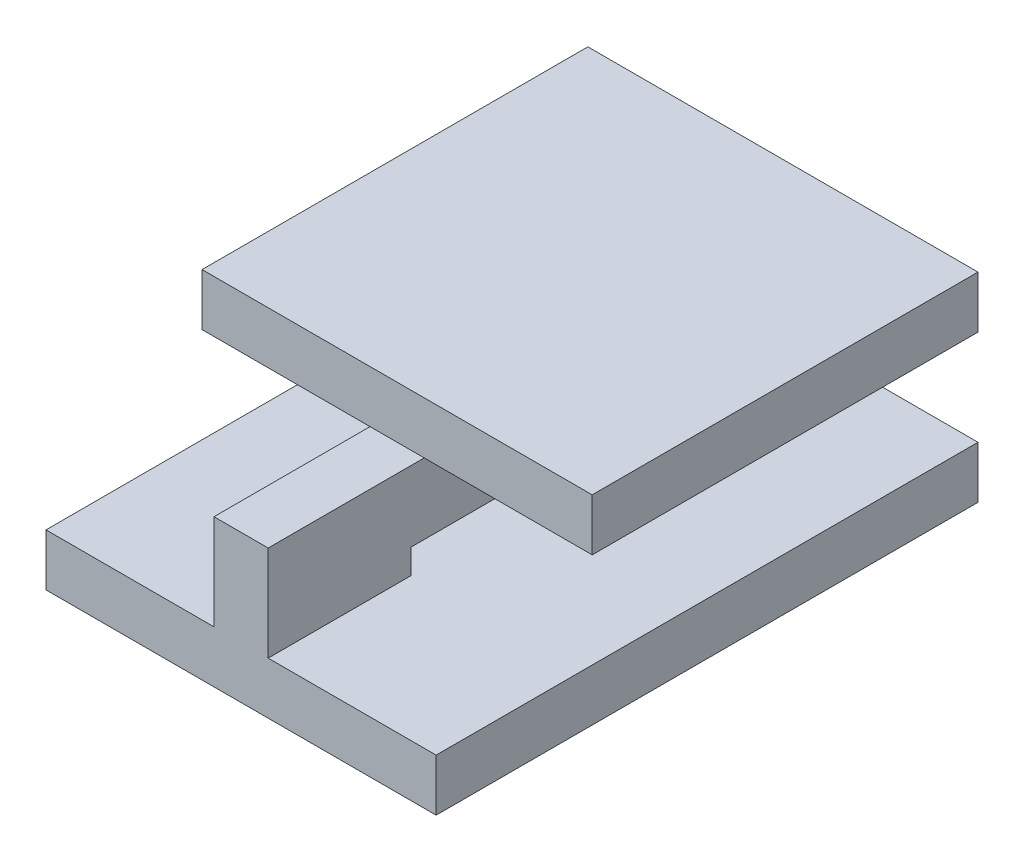
ISO-10303-21;
HEADER;
FILE_DESCRIPTION(('STEP AP214'),'2;1');
FILE_NAME('part.step','',(''),(''),'','','');
FILE_SCHEMA(('AUTOMOTIVE_DESIGN { 1 0 10303 214 1 1 1 1 }'));
ENDSEC;
DATA;
#1=APPLICATION_CONTEXT('core data for automotive mechanical design processes');
#2=APPLICATION_PROTOCOL_DEFINITION('international standard','automotive_design',2000,#1);
#3=PRODUCT_CONTEXT('',#1,'mechanical');
#4=PRODUCT('Part','Part','',(#3));
#5=PRODUCT_RELATED_PRODUCT_CATEGORY('part','',(#4));
#6=PRODUCT_DEFINITION_FORMATION('','',#4);
#7=PRODUCT_DEFINITION_CONTEXT('part definition',#1,'design');
#8=PRODUCT_DEFINITION('design','',#6,#7);
#9=PRODUCT_DEFINITION_SHAPE('','',#8);
#10=(LENGTH_UNIT() NAMED_UNIT(*) SI_UNIT(.MILLI.,.METRE.));
#11=(NAMED_UNIT(*) PLANE_ANGLE_UNIT() SI_UNIT($,.RADIAN.));
#12=(NAMED_UNIT(*) SI_UNIT($,.STERADIAN.) SOLID_ANGLE_UNIT());
#13=UNCERTAINTY_MEASURE_WITH_UNIT(LENGTH_MEASURE(1.E-05),#10,'distance_accuracy_value','');
#14=(GEOMETRIC_REPRESENTATION_CONTEXT(3) GLOBAL_UNCERTAINTY_ASSIGNED_CONTEXT((#13)) GLOBAL_UNIT_ASSIGNED_CONTEXT((#10,
#11,#12)) REPRESENTATION_CONTEXT('',''));
#15=CARTESIAN_POINT('',(0.,0.,0.));
#16=DIRECTION('',(0.,0.,1.));
#17=DIRECTION('',(1.,0.,0.));
#18=AXIS2_PLACEMENT_3D('',#15,#16,#17);
#19=CARTESIAN_POINT('',(0.,12.,-125.));
#20=DIRECTION('',(0.,0.,1.));
#21=DIRECTION('',(1.,0.,0.));
#22=AXIS2_PLACEMENT_3D('',#19,#20,#21);
#23=PLANE('',#22);
#24=DIRECTION('',(0.,-1.,0.));
#25=VECTOR('',#24,1.);
#26=CARTESIAN_POINT('',(0.,12.,-125.));
#27=LINE('',#26,#25);
#28=CARTESIAN_POINT('',(0.,12.,-125.));
#29=VERTEX_POINT('',#28);
#30=CARTESIAN_POINT('',(0.,0.,-125.));
#31=VERTEX_POINT('',#30);
#32=EDGE_CURVE('E278',#29,#31,#27,.T.);
#33=ORIENTED_EDGE('',*,*,#32,.F.);
#34=DIRECTION('',(-1.,0.,0.));
#35=VECTOR('',#34,1.);
#36=CARTESIAN_POINT('',(0.,12.,-125.));
#37=LINE('',#36,#35);
#38=CARTESIAN_POINT('',(90.,12.,-125.));
#39=VERTEX_POINT('',#38);
#40=EDGE_CURVE('E275',#39,#29,#37,.T.);
#41=ORIENTED_EDGE('',*,*,#40,.F.);
#42=DIRECTION('',(0.,-1.,0.));
#43=VECTOR('',#42,1.);
#44=CARTESIAN_POINT('',(90.,12.,-125.));
#45=LINE('',#44,#43);
#46=CARTESIAN_POINT('',(90.,0.,-125.));
#47=VERTEX_POINT('',#46);
#48=EDGE_CURVE('E293',#39,#47,#45,.T.);
#49=ORIENTED_EDGE('',*,*,#48,.T.);
#50=DIRECTION('',(-1.,0.,0.));
#51=VECTOR('',#50,1.);
#52=CARTESIAN_POINT('',(0.,0.,-125.));
#53=LINE('',#52,#51);
#54=EDGE_CURVE('E267',#47,#31,#53,.T.);
#55=ORIENTED_EDGE('',*,*,#54,.T.);
#56=EDGE_LOOP('',(#33,#41,#49,#55));
#57=FACE_BOUND('',#56,.T.);
#58=ADVANCED_FACE('F46',(#57),#23,.F.);
#59=CARTESIAN_POINT('',(0.,34.,0.));
#60=DIRECTION('',(0.,-1.,0.));
#61=DIRECTION('',(0.,0.,-1.));
#62=AXIS2_PLACEMENT_3D('',#59,#60,#61);
#63=PLANE('',#62);
#64=DIRECTION('',(1.,0.,0.));
#65=VECTOR('',#64,1.);
#66=CARTESIAN_POINT('',(0.,34.,-36.));
#67=LINE('',#66,#65);
#68=CARTESIAN_POINT('',(38.75,34.,-36.));
#69=VERTEX_POINT('',#68);
#70=CARTESIAN_POINT('',(51.25,34.,-36.));
#71=VERTEX_POINT('',#70);
#72=EDGE_CURVE('E11',#69,#71,#67,.T.);
#73=ORIENTED_EDGE('',*,*,#72,.F.);
#74=DIRECTION('',(0.,0.,1.));
#75=VECTOR('',#74,1.);
#76=CARTESIAN_POINT('',(38.75,34.,0.));
#77=LINE('',#76,#75);
#78=CARTESIAN_POINT('',(38.75,34.,0.));
#79=VERTEX_POINT('',#78);
#80=EDGE_CURVE('E237',#69,#79,#77,.T.);
#81=ORIENTED_EDGE('',*,*,#80,.T.);
#82=DIRECTION('',(1.,0.,0.));
#83=VECTOR('',#82,1.);
#84=CARTESIAN_POINT('',(38.75,34.,0.));
#85=LINE('',#84,#83);
#86=CARTESIAN_POINT('',(51.25,34.,0.));
#87=VERTEX_POINT('',#86);
#88=EDGE_CURVE('E236',#79,#87,#85,.T.);
#89=ORIENTED_EDGE('',*,*,#88,.T.);
#90=DIRECTION('',(0.,0.,-1.));
#91=VECTOR('',#90,1.);
#92=CARTESIAN_POINT('',(51.25,34.,0.));
#93=LINE('',#92,#91);
#94=EDGE_CURVE('E241',#87,#71,#93,.T.);
#95=ORIENTED_EDGE('',*,*,#94,.T.);
#96=EDGE_LOOP('',(#73,#81,#89,#95));
#97=FACE_BOUND('',#96,.T.);
#98=ADVANCED_FACE('F357',(#97),#63,.F.);
#99=CARTESIAN_POINT('',(0.,12.,0.));
#100=DIRECTION('',(0.,-1.,0.));
#101=DIRECTION('',(0.,0.,-1.));
#102=AXIS2_PLACEMENT_3D('',#99,#100,#101);
#103=PLANE('',#102);
#104=DIRECTION('',(0.,0.,-1.));
#105=VECTOR('',#104,1.);
#106=CARTESIAN_POINT('',(51.25,12.,0.));
#107=LINE('',#106,#105);
#108=CARTESIAN_POINT('',(51.25,12.,0.));
#109=VERTEX_POINT('',#108);
#110=CARTESIAN_POINT('',(51.25,12.,-32.9566359820188));
#111=VERTEX_POINT('',#110);
#112=EDGE_CURVE('E175',#109,#111,#107,.T.);
#113=ORIENTED_EDGE('',*,*,#112,.F.);
#114=DIRECTION('',(1.,0.,0.));
#115=VECTOR('',#114,1.);
#116=CARTESIAN_POINT('',(0.,12.,0.));
#117=LINE('',#116,#115);
#118=CARTESIAN_POINT('',(90.,12.,0.));
#119=VERTEX_POINT('',#118);
#120=EDGE_CURVE('E266',#109,#119,#117,.T.);
#121=ORIENTED_EDGE('',*,*,#120,.T.);
#122=DIRECTION('',(0.,0.,-1.));
#123=VECTOR('',#122,1.);
#124=CARTESIAN_POINT('',(90.,12.,0.));
#125=LINE('',#124,#123);
#126=EDGE_CURVE('E272',#119,#39,#125,.T.);
#127=ORIENTED_EDGE('',*,*,#126,.T.);
#128=ORIENTED_EDGE('',*,*,#40,.T.);
#129=DIRECTION('',(0.,0.,1.));
#130=VECTOR('',#129,1.);
#131=CARTESIAN_POINT('',(0.,12.,0.));
#132=LINE('',#131,#130);
#133=CARTESIAN_POINT('',(0.,12.,0.));
#134=VERTEX_POINT('',#133);
#135=EDGE_CURVE('E263',#29,#134,#132,.T.);
#136=ORIENTED_EDGE('',*,*,#135,.T.);
#137=CARTESIAN_POINT('',(38.75,12.,0.));
#138=VERTEX_POINT('',#137);
#139=EDGE_CURVE('E268',#134,#138,#117,.T.);
#140=ORIENTED_EDGE('',*,*,#139,.T.);
#141=DIRECTION('',(0.,0.,1.));
#142=VECTOR('',#141,1.);
#143=CARTESIAN_POINT('',(38.75,12.,0.));
#144=LINE('',#143,#142);
#145=CARTESIAN_POINT('',(38.75,12.,-32.9566359820188));
#146=VERTEX_POINT('',#145);
#147=EDGE_CURVE('E231',#146,#138,#144,.T.);
#148=ORIENTED_EDGE('',*,*,#147,.F.);
#149=DIRECTION('',(1.,0.,0.));
#150=VECTOR('',#149,1.);
#151=CARTESIAN_POINT('',(0.,12.,-32.9566359820187));
#152=LINE('',#151,#150);
#153=EDGE_CURVE('E165',#146,#111,#152,.T.);
#154=ORIENTED_EDGE('',*,*,#153,.T.);
#155=EDGE_LOOP('',(#113,#121,#127,#128,#136,#140,#148,#154));
#156=FACE_BOUND('',#155,.T.);
#157=ADVANCED_FACE('F321',(#156),#103,.F.);
#158=CARTESIAN_POINT('',(0.,12.,0.));
#159=DIRECTION('',(1.,0.,0.));
#160=DIRECTION('',(0.,0.,-1.));
#161=AXIS2_PLACEMENT_3D('',#158,#159,#160);
#162=PLANE('',#161);
#163=DIRECTION('',(0.,0.,1.));
#164=VECTOR('',#163,1.);
#165=CARTESIAN_POINT('',(0.,0.,0.));
#166=LINE('',#165,#164);
#167=CARTESIAN_POINT('',(0.,0.,0.));
#168=VERTEX_POINT('',#167);
#169=EDGE_CURVE('E262',#31,#168,#166,.T.);
#170=ORIENTED_EDGE('',*,*,#169,.T.);
#171=DIRECTION('',(0.,-1.,0.));
#172=VECTOR('',#171,1.);
#173=CARTESIAN_POINT('',(0.,12.,0.));
#174=LINE('',#173,#172);
#175=EDGE_CURVE('E50',#134,#168,#174,.T.);
#176=ORIENTED_EDGE('',*,*,#175,.F.);
#177=ORIENTED_EDGE('',*,*,#135,.F.);
#178=ORIENTED_EDGE('',*,*,#32,.T.);
#179=EDGE_LOOP('',(#170,#176,#177,#178));
#180=FACE_BOUND('',#179,.T.);
#181=ADVANCED_FACE('F48',(#180),#162,.F.);
#182=CARTESIAN_POINT('',(0.,12.,0.));
#183=DIRECTION('',(0.,0.,-1.));
#184=DIRECTION('',(-1.,0.,0.));
#185=AXIS2_PLACEMENT_3D('',#182,#183,#184);
#186=PLANE('',#185);
#187=DIRECTION('',(1.,0.,0.));
#188=VECTOR('',#187,1.);
#189=CARTESIAN_POINT('',(0.,0.,0.));
#190=LINE('',#189,#188);
#191=CARTESIAN_POINT('',(90.,0.,0.));
#192=VERTEX_POINT('',#191);
#193=EDGE_CURVE('E282',#168,#192,#190,.T.);
#194=ORIENTED_EDGE('',*,*,#193,.T.);
#195=DIRECTION('',(0.,-1.,0.));
#196=VECTOR('',#195,1.);
#197=CARTESIAN_POINT('',(90.,12.,0.));
#198=LINE('',#197,#196);
#199=EDGE_CURVE('E296',#119,#192,#198,.T.);
#200=ORIENTED_EDGE('',*,*,#199,.F.);
#201=ORIENTED_EDGE('',*,*,#120,.F.);
#202=DIRECTION('',(0.,-1.,0.));
#203=VECTOR('',#202,1.);
#204=CARTESIAN_POINT('',(51.25,34.,0.));
#205=LINE('',#204,#203);
#206=EDGE_CURVE('E255',#87,#109,#205,.T.);
#207=ORIENTED_EDGE('',*,*,#206,.F.);
#208=ORIENTED_EDGE('',*,*,#88,.F.);
#209=DIRECTION('',(0.,-1.,0.));
#210=VECTOR('',#209,1.);
#211=CARTESIAN_POINT('',(38.75,34.,0.));
#212=LINE('',#211,#210);
#213=EDGE_CURVE('E258',#79,#138,#212,.T.);
#214=ORIENTED_EDGE('',*,*,#213,.T.);
#215=ORIENTED_EDGE('',*,*,#139,.F.);
#216=ORIENTED_EDGE('',*,*,#175,.T.);
#217=EDGE_LOOP('',(#194,#200,#201,#207,#208,#214,#215,#216));
#218=FACE_BOUND('',#217,.T.);
#219=ADVANCED_FACE('F308',(#218),#186,.F.);
#220=CARTESIAN_POINT('',(90.,12.,0.));
#221=DIRECTION('',(-1.,0.,0.));
#222=DIRECTION('',(0.,0.,1.));
#223=AXIS2_PLACEMENT_3D('',#220,#221,#222);
#224=PLANE('',#223);
#225=DIRECTION('',(0.,0.,-1.));
#226=VECTOR('',#225,1.);
#227=CARTESIAN_POINT('',(90.,0.,0.));
#228=LINE('',#227,#226);
#229=EDGE_CURVE('E285',#192,#47,#228,.T.);
#230=ORIENTED_EDGE('',*,*,#229,.T.);
#231=ORIENTED_EDGE('',*,*,#48,.F.);
#232=ORIENTED_EDGE('',*,*,#126,.F.);
#233=ORIENTED_EDGE('',*,*,#199,.T.);
#234=EDGE_LOOP('',(#230,#231,#232,#233));
#235=FACE_BOUND('',#234,.T.);
#236=ADVANCED_FACE('F317',(#235),#224,.F.);
#237=DIRECTION('',(0.,-1.,0.));
#238=VECTOR('',#237,1.);
#239=CARTESIAN_POINT('',(51.2499999999999,34.,-125.));
#240=LINE('',#239,#238);
#241=CARTESIAN_POINT('',(51.2499999999999,34.,-125.));
#242=VERTEX_POINT('',#241);
#243=CARTESIAN_POINT('',(51.2499999999999,17.6974216963706,-125.));
#244=VERTEX_POINT('',#243);
#245=EDGE_CURVE('E252',#242,#244,#240,.T.);
#246=ORIENTED_EDGE('',*,*,#245,.T.);
#247=DIRECTION('',(1.,0.,0.));
#248=VECTOR('',#247,1.);
#249=CARTESIAN_POINT('',(0.,17.6974216963706,-125.));
#250=LINE('',#249,#248);
#251=CARTESIAN_POINT('',(38.75,17.6974216963706,-125.));
#252=VERTEX_POINT('',#251);
#253=EDGE_CURVE('E65',#252,#244,#250,.T.);
#254=ORIENTED_EDGE('',*,*,#253,.F.);
#255=DIRECTION('',(0.,-1.,0.));
#256=VECTOR('',#255,1.);
#257=CARTESIAN_POINT('',(38.75,34.,-125.));
#258=LINE('',#257,#256);
#259=CARTESIAN_POINT('',(38.75,34.,-125.));
#260=VERTEX_POINT('',#259);
#261=EDGE_CURVE('E244',#260,#252,#258,.T.);
#262=ORIENTED_EDGE('',*,*,#261,.F.);
#263=DIRECTION('',(1.,0.,0.));
#264=VECTOR('',#263,1.);
#265=CARTESIAN_POINT('',(0.,34.,-125.));
#266=LINE('',#265,#264);
#267=CARTESIAN_POINT('',(0.,34.,-125.));
#268=VERTEX_POINT('',#267);
#269=EDGE_CURVE('E208',#268,#260,#266,.T.);
#270=ORIENTED_EDGE('',*,*,#269,.F.);
#271=DIRECTION('',(0.,-1.,0.));
#272=VECTOR('',#271,1.);
#273=CARTESIAN_POINT('',(0.,46.,-125.));
#274=LINE('',#273,#272);
#275=CARTESIAN_POINT('',(0.,46.,-125.));
#276=VERTEX_POINT('',#275);
#277=EDGE_CURVE('E224',#276,#268,#274,.T.);
#278=ORIENTED_EDGE('',*,*,#277,.F.);
#279=DIRECTION('',(1.,0.,0.));
#280=VECTOR('',#279,1.);
#281=CARTESIAN_POINT('',(0.,46.,-125.));
#282=LINE('',#281,#280);
#283=CARTESIAN_POINT('',(90.,46.,-125.));
#284=VERTEX_POINT('',#283);
#285=EDGE_CURVE('E193',#276,#284,#282,.T.);
#286=ORIENTED_EDGE('',*,*,#285,.T.);
#287=DIRECTION('',(0.,-1.,0.));
#288=VECTOR('',#287,1.);
#289=CARTESIAN_POINT('',(90.,46.,-125.));
#290=LINE('',#289,#288);
#291=CARTESIAN_POINT('',(90.,34.,-125.));
#292=VERTEX_POINT('',#291);
#293=EDGE_CURVE('E227',#284,#292,#290,.T.);
#294=ORIENTED_EDGE('',*,*,#293,.T.);
#295=EDGE_CURVE('E207',#242,#292,#266,.T.);
#296=ORIENTED_EDGE('',*,*,#295,.F.);
#297=EDGE_LOOP('',(#246,#254,#262,#270,#278,#286,#294,#296));
#298=FACE_BOUND('',#297,.T.);
#299=ADVANCED_FACE('F337',(#298),#23,.F.);
#300=CARTESIAN_POINT('',(0.,0.,0.));
#301=DIRECTION('',(0.,-1.,0.));
#302=DIRECTION('',(0.,0.,-1.));
#303=AXIS2_PLACEMENT_3D('',#300,#301,#302);
#304=PLANE('',#303);
#305=ORIENTED_EDGE('',*,*,#169,.F.);
#306=ORIENTED_EDGE('',*,*,#54,.F.);
#307=ORIENTED_EDGE('',*,*,#229,.F.);
#308=ORIENTED_EDGE('',*,*,#193,.F.);
#309=EDGE_LOOP('',(#305,#306,#307,#308));
#310=FACE_BOUND('',#309,.T.);
#311=ADVANCED_FACE('F315',(#310),#304,.T.);
#312=CARTESIAN_POINT('',(38.75,34.,0.));
#313=DIRECTION('',(1.,0.,0.));
#314=DIRECTION('',(0.,0.,-1.));
#315=AXIS2_PLACEMENT_3D('',#312,#313,#314);
#316=PLANE('',#315);
#317=DIRECTION('',(0.,0.,1.));
#318=VECTOR('',#317,1.);
#319=CARTESIAN_POINT('',(38.75,17.6974216963706,0.));
#320=LINE('',#319,#318);
#321=CARTESIAN_POINT('',(38.75,17.6974216963706,-32.9566359820188));
#322=VERTEX_POINT('',#321);
#323=EDGE_CURVE('E182',#252,#322,#320,.T.);
#324=ORIENTED_EDGE('',*,*,#323,.T.);
#325=DIRECTION('',(0.,-1.,0.));
#326=VECTOR('',#325,1.);
#327=CARTESIAN_POINT('',(38.75,34.,-32.9566359820188));
#328=LINE('',#327,#326);
#329=EDGE_CURVE('E162',#322,#146,#328,.T.);
#330=ORIENTED_EDGE('',*,*,#329,.T.);
#331=ORIENTED_EDGE('',*,*,#147,.T.);
#332=ORIENTED_EDGE('',*,*,#213,.F.);
#333=ORIENTED_EDGE('',*,*,#80,.F.);
#334=EDGE_CURVE('E232',#260,#69,#77,.T.);
#335=ORIENTED_EDGE('',*,*,#334,.F.);
#336=ORIENTED_EDGE('',*,*,#261,.T.);
#337=EDGE_LOOP('',(#324,#330,#331,#332,#333,#335,#336));
#338=FACE_BOUND('',#337,.T.);
#339=ADVANCED_FACE('F354',(#338),#316,.F.);
#340=CARTESIAN_POINT('',(51.25,34.,0.));
#341=DIRECTION('',(-1.,0.,0.));
#342=DIRECTION('',(0.,0.,1.));
#343=AXIS2_PLACEMENT_3D('',#340,#341,#342);
#344=PLANE('',#343);
#345=ORIENTED_EDGE('',*,*,#112,.T.);
#346=DIRECTION('',(0.,-1.,0.));
#347=VECTOR('',#346,1.);
#348=CARTESIAN_POINT('',(51.25,12.,-32.9566359820188));
#349=LINE('',#348,#347);
#350=CARTESIAN_POINT('',(51.25,17.6974216963706,-32.9566359820188));
#351=VERTEX_POINT('',#350);
#352=EDGE_CURVE('E159',#351,#111,#349,.T.);
#353=ORIENTED_EDGE('',*,*,#352,.F.);
#354=DIRECTION('',(0.,0.,1.));
#355=VECTOR('',#354,1.);
#356=CARTESIAN_POINT('',(51.2499999999999,17.6974216963706,-125.));
#357=LINE('',#356,#355);
#358=EDGE_CURVE('E167',#244,#351,#357,.T.);
#359=ORIENTED_EDGE('',*,*,#358,.F.);
#360=ORIENTED_EDGE('',*,*,#245,.F.);
#361=EDGE_CURVE('E240',#71,#242,#93,.T.);
#362=ORIENTED_EDGE('',*,*,#361,.F.);
#363=ORIENTED_EDGE('',*,*,#94,.F.);
#364=ORIENTED_EDGE('',*,*,#206,.T.);
#365=EDGE_LOOP('',(#345,#353,#359,#360,#362,#363,#364));
#366=FACE_BOUND('',#365,.T.);
#367=ADVANCED_FACE('F173',(#366),#344,.F.);
#368=CARTESIAN_POINT('',(0.,34.,0.));
#369=DIRECTION('',(0.,1.,0.));
#370=DIRECTION('',(0.,0.,1.));
#371=AXIS2_PLACEMENT_3D('',#368,#369,#370);
#372=PLANE('',#371);
#373=ORIENTED_EDGE('',*,*,#269,.T.);
#374=ORIENTED_EDGE('',*,*,#334,.T.);
#375=CARTESIAN_POINT('',(0.,34.,-36.));
#376=VERTEX_POINT('',#375);
#377=EDGE_CURVE('E57',#376,#69,#67,.T.);
#378=ORIENTED_EDGE('',*,*,#377,.F.);
#379=DIRECTION('',(0.,0.,1.));
#380=VECTOR('',#379,1.);
#381=CARTESIAN_POINT('',(0.,34.,0.));
#382=LINE('',#381,#380);
#383=EDGE_CURVE('E212',#268,#376,#382,.T.);
#384=ORIENTED_EDGE('',*,*,#383,.F.);
#385=EDGE_LOOP('',(#373,#374,#378,#384));
#386=FACE_BOUND('',#385,.T.);
#387=ADVANCED_FACE('F350',(#386),#372,.F.);
#388=CARTESIAN_POINT('',(90.,34.,-36.));
#389=VERTEX_POINT('',#388);
#390=EDGE_CURVE('E58',#71,#389,#67,.T.);
#391=ORIENTED_EDGE('',*,*,#390,.F.);
#392=ORIENTED_EDGE('',*,*,#361,.T.);
#393=ORIENTED_EDGE('',*,*,#295,.T.);
#394=DIRECTION('',(0.,0.,1.));
#395=VECTOR('',#394,1.);
#396=CARTESIAN_POINT('',(90.,34.,0.));
#397=LINE('',#396,#395);
#398=EDGE_CURVE('E188',#292,#389,#397,.T.);
#399=ORIENTED_EDGE('',*,*,#398,.T.);
#400=EDGE_LOOP('',(#391,#392,#393,#399));
#401=FACE_BOUND('',#400,.T.);
#402=ADVANCED_FACE('F333',(#401),#372,.F.);
#403=CARTESIAN_POINT('',(90.,46.,0.));
#404=DIRECTION('',(1.,0.,0.));
#405=DIRECTION('',(0.,0.,-1.));
#406=AXIS2_PLACEMENT_3D('',#403,#404,#405);
#407=PLANE('',#406);
#408=ORIENTED_EDGE('',*,*,#398,.F.);
#409=ORIENTED_EDGE('',*,*,#293,.F.);
#410=DIRECTION('',(0.,0.,1.));
#411=VECTOR('',#410,1.);
#412=CARTESIAN_POINT('',(90.,46.,0.));
#413=LINE('',#412,#411);
#414=CARTESIAN_POINT('',(90.,46.,-36.));
#415=VERTEX_POINT('',#414);
#416=EDGE_CURVE('E189',#284,#415,#413,.T.);
#417=ORIENTED_EDGE('',*,*,#416,.T.);
#418=DIRECTION('',(0.,-1.,0.));
#419=VECTOR('',#418,1.);
#420=CARTESIAN_POINT('',(90.,46.,-36.));
#421=LINE('',#420,#419);
#422=EDGE_CURVE('E203',#415,#389,#421,.T.);
#423=ORIENTED_EDGE('',*,*,#422,.T.);
#424=EDGE_LOOP('',(#408,#409,#417,#423));
#425=FACE_BOUND('',#424,.T.);
#426=ADVANCED_FACE('F341',(#425),#407,.T.);
#427=CARTESIAN_POINT('',(0.,46.,0.));
#428=DIRECTION('',(1.,0.,0.));
#429=DIRECTION('',(0.,0.,-1.));
#430=AXIS2_PLACEMENT_3D('',#427,#428,#429);
#431=PLANE('',#430);
#432=ORIENTED_EDGE('',*,*,#383,.T.);
#433=DIRECTION('',(0.,-1.,0.));
#434=VECTOR('',#433,1.);
#435=CARTESIAN_POINT('',(0.,46.,-36.));
#436=LINE('',#435,#434);
#437=CARTESIAN_POINT('',(0.,46.,-36.));
#438=VERTEX_POINT('',#437);
#439=EDGE_CURVE('E220',#438,#376,#436,.T.);
#440=ORIENTED_EDGE('',*,*,#439,.F.);
#441=DIRECTION('',(0.,0.,1.));
#442=VECTOR('',#441,1.);
#443=CARTESIAN_POINT('',(0.,46.,0.));
#444=LINE('',#443,#442);
#445=EDGE_CURVE('E197',#276,#438,#444,.T.);
#446=ORIENTED_EDGE('',*,*,#445,.F.);
#447=ORIENTED_EDGE('',*,*,#277,.T.);
#448=EDGE_LOOP('',(#432,#440,#446,#447));
#449=FACE_BOUND('',#448,.T.);
#450=ADVANCED_FACE('F361',(#449),#431,.F.);
#451=CARTESIAN_POINT('',(0.,46.,-36.));
#452=DIRECTION('',(0.,0.,-1.));
#453=DIRECTION('',(-1.,0.,0.));
#454=AXIS2_PLACEMENT_3D('',#451,#452,#453);
#455=PLANE('',#454);
#456=ORIENTED_EDGE('',*,*,#377,.T.);
#457=ORIENTED_EDGE('',*,*,#72,.T.);
#458=ORIENTED_EDGE('',*,*,#390,.T.);
#459=ORIENTED_EDGE('',*,*,#422,.F.);
#460=DIRECTION('',(1.,0.,0.));
#461=VECTOR('',#460,1.);
#462=CARTESIAN_POINT('',(0.,46.,-36.));
#463=LINE('',#462,#461);
#464=EDGE_CURVE('E200',#438,#415,#463,.T.);
#465=ORIENTED_EDGE('',*,*,#464,.F.);
#466=ORIENTED_EDGE('',*,*,#439,.T.);
#467=EDGE_LOOP('',(#456,#457,#458,#459,#465,#466));
#468=FACE_BOUND('',#467,.T.);
#469=ADVANCED_FACE('F345',(#468),#455,.F.);
#470=CARTESIAN_POINT('',(0.,46.,0.));
#471=DIRECTION('',(0.,1.,0.));
#472=DIRECTION('',(0.,0.,1.));
#473=AXIS2_PLACEMENT_3D('',#470,#471,#472);
#474=PLANE('',#473);
#475=ORIENTED_EDGE('',*,*,#416,.F.);
#476=ORIENTED_EDGE('',*,*,#285,.F.);
#477=ORIENTED_EDGE('',*,*,#445,.T.);
#478=ORIENTED_EDGE('',*,*,#464,.T.);
#479=EDGE_LOOP('',(#475,#476,#477,#478));
#480=FACE_BOUND('',#479,.T.);
#481=ADVANCED_FACE('F363',(#480),#474,.T.);
#482=CARTESIAN_POINT('',(0.,12.,-32.9566359820187));
#483=DIRECTION('',(0.,0.,1.));
#484=DIRECTION('',(1.,0.,0.));
#485=AXIS2_PLACEMENT_3D('',#482,#483,#484);
#486=PLANE('',#485);
#487=DIRECTION('',(1.,0.,0.));
#488=VECTOR('',#487,1.);
#489=CARTESIAN_POINT('',(0.,17.6974216963706,-32.9566359820187));
#490=LINE('',#489,#488);
#491=EDGE_CURVE('E156',#322,#351,#490,.T.);
#492=ORIENTED_EDGE('',*,*,#491,.T.);
#493=ORIENTED_EDGE('',*,*,#352,.T.);
#494=ORIENTED_EDGE('',*,*,#153,.F.);
#495=ORIENTED_EDGE('',*,*,#329,.F.);
#496=EDGE_LOOP('',(#492,#493,#494,#495));
#497=FACE_BOUND('',#496,.T.);
#498=ADVANCED_FACE('F157',(#497),#486,.F.);
#499=CARTESIAN_POINT('',(0.,17.6974216963706,-125.));
#500=DIRECTION('',(0.,1.,0.));
#501=DIRECTION('',(0.,0.,1.));
#502=AXIS2_PLACEMENT_3D('',#499,#500,#501);
#503=PLANE('',#502);
#504=ORIENTED_EDGE('',*,*,#253,.T.);
#505=ORIENTED_EDGE('',*,*,#358,.T.);
#506=ORIENTED_EDGE('',*,*,#491,.F.);
#507=ORIENTED_EDGE('',*,*,#323,.F.);
#508=EDGE_LOOP('',(#504,#505,#506,#507));
#509=FACE_BOUND('',#508,.T.);
#510=ADVANCED_FACE('F168',(#509),#503,.F.);
#511=CLOSED_SHELL('',(#58,#98,#157,#181,#219,#236,#299,#311,#339,#367,#387,#402,#426,#450,#469,
#481,#498,#510));
#512=MANIFOLD_SOLID_BREP('B2',#511);
#513=ADVANCED_BREP_SHAPE_REPRESENTATION('',(#18,#512),#14);
#514=SHAPE_DEFINITION_REPRESENTATION(#9,#513);
ENDSEC;
END-ISO-10303-21;
